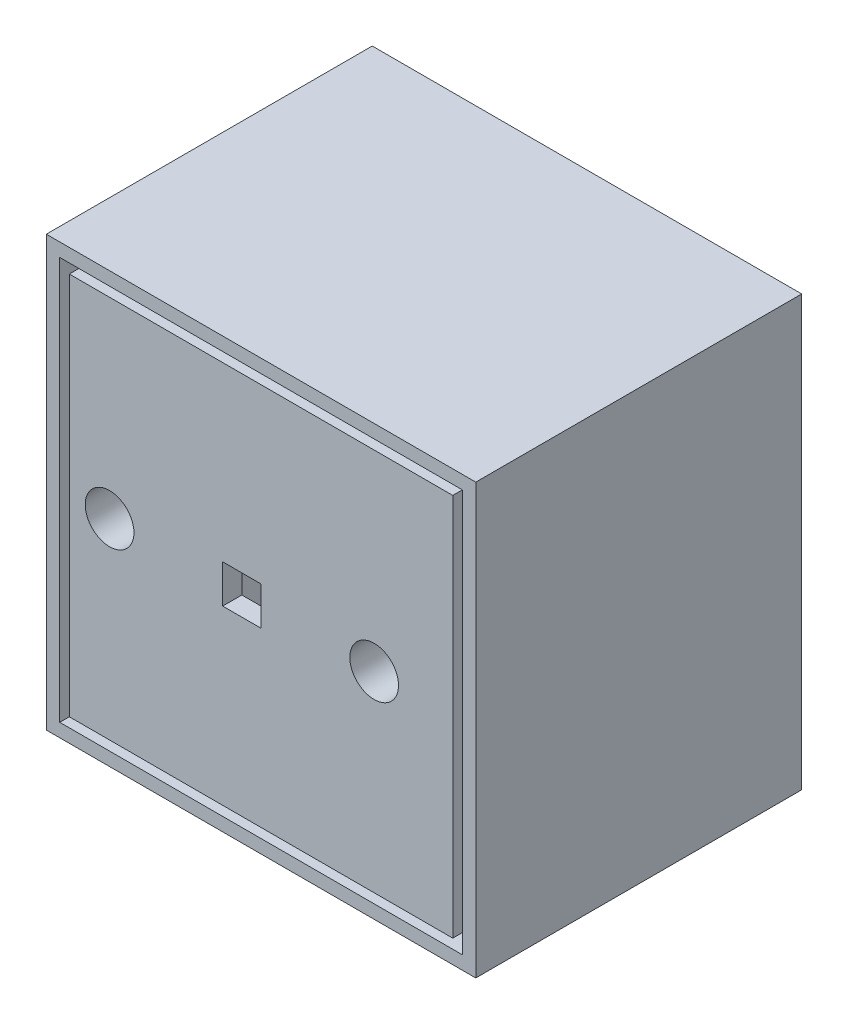
ISO-10303-21;
HEADER;
FILE_DESCRIPTION(('STEP AP214'),'2;1');
FILE_NAME('part.step','',(''),(''),'','','');
FILE_SCHEMA(('AUTOMOTIVE_DESIGN { 1 0 10303 214 1 1 1 1 }'));
ENDSEC;
DATA;
#1=APPLICATION_CONTEXT('core data for automotive mechanical design processes');
#2=APPLICATION_PROTOCOL_DEFINITION('international standard','automotive_design',2000,#1);
#3=PRODUCT_CONTEXT('',#1,'mechanical');
#4=PRODUCT('Part','Part','',(#3));
#5=PRODUCT_RELATED_PRODUCT_CATEGORY('part','',(#4));
#6=PRODUCT_DEFINITION_FORMATION('','',#4);
#7=PRODUCT_DEFINITION_CONTEXT('part definition',#1,'design');
#8=PRODUCT_DEFINITION('design','',#6,#7);
#9=PRODUCT_DEFINITION_SHAPE('','',#8);
#10=(LENGTH_UNIT() NAMED_UNIT(*) SI_UNIT(.MILLI.,.METRE.));
#11=(NAMED_UNIT(*) PLANE_ANGLE_UNIT() SI_UNIT($,.RADIAN.));
#12=(NAMED_UNIT(*) SI_UNIT($,.STERADIAN.) SOLID_ANGLE_UNIT());
#13=UNCERTAINTY_MEASURE_WITH_UNIT(LENGTH_MEASURE(1.E-05),#10,'distance_accuracy_value','');
#14=(GEOMETRIC_REPRESENTATION_CONTEXT(3) GLOBAL_UNCERTAINTY_ASSIGNED_CONTEXT((#13)) GLOBAL_UNIT_ASSIGNED_CONTEXT((#10,
#11,#12)) REPRESENTATION_CONTEXT('',''));
#15=CARTESIAN_POINT('',(0.,0.,0.));
#16=DIRECTION('',(0.,0.,1.));
#17=DIRECTION('',(1.,0.,0.));
#18=AXIS2_PLACEMENT_3D('',#15,#16,#17);
#19=CARTESIAN_POINT('',(0.,5.,5.));
#20=DIRECTION('',(-1.,0.,0.));
#21=DIRECTION('',(0.,-1.,0.));
#22=AXIS2_PLACEMENT_3D('',#19,#20,#21);
#23=PLANE('',#22);
#24=DIRECTION('',(0.,0.,-1.));
#25=VECTOR('',#24,1.);
#26=CARTESIAN_POINT('',(0.,5.,5.));
#27=LINE('',#26,#25);
#28=CARTESIAN_POINT('',(0.,5.,25.));
#29=VERTEX_POINT('',#28);
#30=CARTESIAN_POINT('',(0.,5.,20.));
#31=VERTEX_POINT('',#30);
#32=EDGE_CURVE('E497',#29,#31,#27,.T.);
#33=ORIENTED_EDGE('',*,*,#32,.T.);
#34=DIRECTION('',(0.,-1.,0.));
#35=VECTOR('',#34,1.);
#36=CARTESIAN_POINT('',(0.,5.,20.));
#37=LINE('',#36,#35);
#38=CARTESIAN_POINT('',(0.,-5.,20.));
#39=VERTEX_POINT('',#38);
#40=EDGE_CURVE('E345',#31,#39,#37,.T.);
#41=ORIENTED_EDGE('',*,*,#40,.T.);
#42=DIRECTION('',(0.,0.,-1.));
#43=VECTOR('',#42,1.);
#44=CARTESIAN_POINT('',(0.,-5.,5.));
#45=LINE('',#44,#43);
#46=CARTESIAN_POINT('',(0.,-5.,25.));
#47=VERTEX_POINT('',#46);
#48=EDGE_CURVE('E485',#47,#39,#45,.T.);
#49=ORIENTED_EDGE('',*,*,#48,.F.);
#50=DIRECTION('',(0.,-1.,0.));
#51=VECTOR('',#50,1.);
#52=CARTESIAN_POINT('',(0.,0.,25.));
#53=LINE('',#52,#51);
#54=EDGE_CURVE('E438',#29,#47,#53,.T.);
#55=ORIENTED_EDGE('',*,*,#54,.F.);
#56=EDGE_LOOP('',(#33,#41,#49,#55));
#57=FACE_BOUND('',#56,.T.);
#58=ADVANCED_FACE('F65',(#57),#23,.T.);
#59=CARTESIAN_POINT('',(-10.,5.,5.));
#60=DIRECTION('',(0.,-1.,0.));
#61=DIRECTION('',(0.,0.,-1.));
#62=AXIS2_PLACEMENT_3D('',#59,#60,#61);
#63=PLANE('',#62);
#64=DIRECTION('',(0.,0.,-1.));
#65=VECTOR('',#64,1.);
#66=CARTESIAN_POINT('',(-10.,5.,5.));
#67=LINE('',#66,#65);
#68=CARTESIAN_POINT('',(-10.,5.,25.));
#69=VERTEX_POINT('',#68);
#70=CARTESIAN_POINT('',(-10.,5.,20.));
#71=VERTEX_POINT('',#70);
#72=EDGE_CURVE('E493',#69,#71,#67,.T.);
#73=ORIENTED_EDGE('',*,*,#72,.T.);
#74=DIRECTION('',(1.,0.,0.));
#75=VECTOR('',#74,1.);
#76=CARTESIAN_POINT('',(-10.,5.,20.));
#77=LINE('',#76,#75);
#78=EDGE_CURVE('E341',#71,#31,#77,.T.);
#79=ORIENTED_EDGE('',*,*,#78,.T.);
#80=ORIENTED_EDGE('',*,*,#32,.F.);
#81=DIRECTION('',(1.,0.,0.));
#82=VECTOR('',#81,1.);
#83=CARTESIAN_POINT('',(0.,5.,25.));
#84=LINE('',#83,#82);
#85=EDGE_CURVE('E434',#69,#29,#84,.T.);
#86=ORIENTED_EDGE('',*,*,#85,.F.);
#87=EDGE_LOOP('',(#73,#79,#80,#86));
#88=FACE_BOUND('',#87,.T.);
#89=ADVANCED_FACE('F540',(#88),#63,.T.);
#90=CARTESIAN_POINT('',(-10.,5.,5.));
#91=DIRECTION('',(1.,0.,0.));
#92=DIRECTION('',(0.,0.,-1.));
#93=AXIS2_PLACEMENT_3D('',#90,#91,#92);
#94=PLANE('',#93);
#95=DIRECTION('',(0.,0.,-1.));
#96=VECTOR('',#95,1.);
#97=CARTESIAN_POINT('',(-10.,-5.,5.));
#98=LINE('',#97,#96);
#99=CARTESIAN_POINT('',(-10.,-5.,25.));
#100=VERTEX_POINT('',#99);
#101=CARTESIAN_POINT('',(-10.,-5.,20.));
#102=VERTEX_POINT('',#101);
#103=EDGE_CURVE('E489',#100,#102,#98,.T.);
#104=ORIENTED_EDGE('',*,*,#103,.T.);
#105=DIRECTION('',(0.,1.,0.));
#106=VECTOR('',#105,1.);
#107=CARTESIAN_POINT('',(-10.,5.,20.));
#108=LINE('',#107,#106);
#109=EDGE_CURVE('E329',#102,#71,#108,.T.);
#110=ORIENTED_EDGE('',*,*,#109,.T.);
#111=ORIENTED_EDGE('',*,*,#72,.F.);
#112=DIRECTION('',(0.,1.,0.));
#113=VECTOR('',#112,1.);
#114=CARTESIAN_POINT('',(-10.,0.,25.));
#115=LINE('',#114,#113);
#116=EDGE_CURVE('E446',#100,#69,#115,.T.);
#117=ORIENTED_EDGE('',*,*,#116,.F.);
#118=EDGE_LOOP('',(#104,#110,#111,#117));
#119=FACE_BOUND('',#118,.T.);
#120=ADVANCED_FACE('F546',(#119),#94,.T.);
#121=CARTESIAN_POINT('',(-10.,-5.,5.));
#122=DIRECTION('',(0.,1.,0.));
#123=DIRECTION('',(0.,0.,1.));
#124=AXIS2_PLACEMENT_3D('',#121,#122,#123);
#125=PLANE('',#124);
#126=ORIENTED_EDGE('',*,*,#48,.T.);
#127=DIRECTION('',(-1.,0.,0.));
#128=VECTOR('',#127,1.);
#129=CARTESIAN_POINT('',(-10.,-5.,20.));
#130=LINE('',#129,#128);
#131=EDGE_CURVE('E12',#39,#102,#130,.T.);
#132=ORIENTED_EDGE('',*,*,#131,.T.);
#133=ORIENTED_EDGE('',*,*,#103,.F.);
#134=DIRECTION('',(-1.,0.,0.));
#135=VECTOR('',#134,1.);
#136=CARTESIAN_POINT('',(0.,-5.,25.));
#137=LINE('',#136,#135);
#138=EDGE_CURVE('E442',#47,#100,#137,.T.);
#139=ORIENTED_EDGE('',*,*,#138,.F.);
#140=EDGE_LOOP('',(#126,#132,#133,#139));
#141=FACE_BOUND('',#140,.T.);
#142=ADVANCED_FACE('F554',(#141),#125,.T.);
#143=CARTESIAN_POINT('',(0.,0.,5.));
#144=DIRECTION('',(0.,0.,-1.));
#145=DIRECTION('',(-1.,0.,0.));
#146=AXIS2_PLACEMENT_3D('',#143,#144,#145);
#147=PLANE('',#146);
#148=DIRECTION('',(1.,0.,0.));
#149=VECTOR('',#148,1.);
#150=CARTESIAN_POINT('',(0.,-52.5,5.));
#151=LINE('',#150,#149);
#152=CARTESIAN_POINT('',(-52.5,-52.5,5.));
#153=VERTEX_POINT('',#152);
#154=CARTESIAN_POINT('',(52.5,-52.5,5.));
#155=VERTEX_POINT('',#154);
#156=EDGE_CURVE('E384',#153,#155,#151,.T.);
#157=ORIENTED_EDGE('',*,*,#156,.T.);
#158=DIRECTION('',(0.,1.,0.));
#159=VECTOR('',#158,1.);
#160=CARTESIAN_POINT('',(52.5,0.,5.));
#161=LINE('',#160,#159);
#162=CARTESIAN_POINT('',(52.5,52.5,5.));
#163=VERTEX_POINT('',#162);
#164=EDGE_CURVE('E349',#155,#163,#161,.T.);
#165=ORIENTED_EDGE('',*,*,#164,.T.);
#166=DIRECTION('',(1.,0.,0.));
#167=VECTOR('',#166,1.);
#168=CARTESIAN_POINT('',(0.,52.5,5.));
#169=LINE('',#168,#167);
#170=CARTESIAN_POINT('',(-52.5,52.5,5.));
#171=VERTEX_POINT('',#170);
#172=EDGE_CURVE('E355',#171,#163,#169,.T.);
#173=ORIENTED_EDGE('',*,*,#172,.F.);
#174=DIRECTION('',(0.,1.,0.));
#175=VECTOR('',#174,1.);
#176=CARTESIAN_POINT('',(-52.5,0.,5.));
#177=LINE('',#176,#175);
#178=EDGE_CURVE('E387',#153,#171,#177,.T.);
#179=ORIENTED_EDGE('',*,*,#178,.F.);
#180=EDGE_LOOP('',(#157,#165,#173,#179));
#181=FACE_BOUND('',#180,.T.);
#182=DIRECTION('',(1.,0.,0.));
#183=VECTOR('',#182,1.);
#184=CARTESIAN_POINT('',(0.,50.,5.));
#185=LINE('',#184,#183);
#186=CARTESIAN_POINT('',(-50.,50.,5.));
#187=VERTEX_POINT('',#186);
#188=CARTESIAN_POINT('',(50.,50.,5.));
#189=VERTEX_POINT('',#188);
#190=EDGE_CURVE('E462',#187,#189,#185,.T.);
#191=ORIENTED_EDGE('',*,*,#190,.T.);
#192=DIRECTION('',(0.,-1.,0.));
#193=VECTOR('',#192,1.);
#194=CARTESIAN_POINT('',(50.,0.,5.));
#195=LINE('',#194,#193);
#196=CARTESIAN_POINT('',(50.,-50.,5.));
#197=VERTEX_POINT('',#196);
#198=EDGE_CURVE('E458',#189,#197,#195,.T.);
#199=ORIENTED_EDGE('',*,*,#198,.T.);
#200=DIRECTION('',(1.,0.,0.));
#201=VECTOR('',#200,1.);
#202=CARTESIAN_POINT('',(0.,-50.,5.));
#203=LINE('',#202,#201);
#204=CARTESIAN_POINT('',(-50.,-50.,5.));
#205=VERTEX_POINT('',#204);
#206=EDGE_CURVE('E415',#205,#197,#203,.T.);
#207=ORIENTED_EDGE('',*,*,#206,.F.);
#208=DIRECTION('',(0.,-1.,0.));
#209=VECTOR('',#208,1.);
#210=CARTESIAN_POINT('',(-50.,0.,5.));
#211=LINE('',#210,#209);
#212=EDGE_CURVE('E466',#187,#205,#211,.T.);
#213=ORIENTED_EDGE('',*,*,#212,.F.);
#214=EDGE_LOOP('',(#191,#199,#207,#213));
#215=FACE_BOUND('',#214,.T.);
#216=ADVANCED_FACE('F551',(#181,#215),#147,.F.);
#217=CARTESIAN_POINT('',(0.,0.,0.));
#218=DIRECTION('',(0.,0.,-1.));
#219=DIRECTION('',(-1.,0.,0.));
#220=AXIS2_PLACEMENT_3D('',#217,#218,#219);
#221=PLANE('',#220);
#222=DIRECTION('',(0.,1.,0.));
#223=VECTOR('',#222,1.);
#224=CARTESIAN_POINT('',(-50.,0.,0.));
#225=LINE('',#224,#223);
#226=CARTESIAN_POINT('',(-50.,-50.,0.));
#227=VERTEX_POINT('',#226);
#228=CARTESIAN_POINT('',(-50.,50.,0.));
#229=VERTEX_POINT('',#228);
#230=EDGE_CURVE('E234',#227,#229,#225,.T.);
#231=ORIENTED_EDGE('',*,*,#230,.T.);
#232=DIRECTION('',(-1.,0.,0.));
#233=VECTOR('',#232,1.);
#234=CARTESIAN_POINT('',(0.,50.,0.));
#235=LINE('',#234,#233);
#236=CARTESIAN_POINT('',(50.,50.,0.));
#237=VERTEX_POINT('',#236);
#238=EDGE_CURVE('E250',#237,#229,#235,.T.);
#239=ORIENTED_EDGE('',*,*,#238,.F.);
#240=DIRECTION('',(0.,1.,0.));
#241=VECTOR('',#240,1.);
#242=CARTESIAN_POINT('',(50.,0.,0.));
#243=LINE('',#242,#241);
#244=CARTESIAN_POINT('',(50.,-50.,0.));
#245=VERTEX_POINT('',#244);
#246=EDGE_CURVE('E284',#245,#237,#243,.T.);
#247=ORIENTED_EDGE('',*,*,#246,.F.);
#248=DIRECTION('',(-1.,0.,0.));
#249=VECTOR('',#248,1.);
#250=CARTESIAN_POINT('',(0.,-50.,0.));
#251=LINE('',#250,#249);
#252=EDGE_CURVE('E281',#245,#227,#251,.T.);
#253=ORIENTED_EDGE('',*,*,#252,.T.);
#254=EDGE_LOOP('',(#231,#239,#247,#253));
#255=FACE_BOUND('',#254,.T.);
#256=DIRECTION('',(0.,1.,0.));
#257=VECTOR('',#256,1.);
#258=CARTESIAN_POINT('',(-30.,25.,0.));
#259=LINE('',#258,#257);
#260=CARTESIAN_POINT('',(-30.,-25.,0.));
#261=VERTEX_POINT('',#260);
#262=CARTESIAN_POINT('',(-30.,25.,0.));
#263=VERTEX_POINT('',#262);
#264=EDGE_CURVE('E89',#261,#263,#259,.T.);
#265=ORIENTED_EDGE('',*,*,#264,.F.);
#266=DIRECTION('',(-1.,0.,0.));
#267=VECTOR('',#266,1.);
#268=CARTESIAN_POINT('',(20.,-25.,0.));
#269=LINE('',#268,#267);
#270=CARTESIAN_POINT('',(20.,-25.,0.));
#271=VERTEX_POINT('',#270);
#272=EDGE_CURVE('E300',#271,#261,#269,.T.);
#273=ORIENTED_EDGE('',*,*,#272,.F.);
#274=DIRECTION('',(0.,-1.,0.));
#275=VECTOR('',#274,1.);
#276=CARTESIAN_POINT('',(20.,25.,0.));
#277=LINE('',#276,#275);
#278=CARTESIAN_POINT('',(20.,25.,0.));
#279=VERTEX_POINT('',#278);
#280=EDGE_CURVE('E319',#279,#271,#277,.T.);
#281=ORIENTED_EDGE('',*,*,#280,.F.);
#282=DIRECTION('',(1.,0.,0.));
#283=VECTOR('',#282,1.);
#284=CARTESIAN_POINT('',(20.,25.,0.));
#285=LINE('',#284,#283);
#286=EDGE_CURVE('E315',#263,#279,#285,.T.);
#287=ORIENTED_EDGE('',*,*,#286,.F.);
#288=EDGE_LOOP('',(#265,#273,#281,#287));
#289=FACE_BOUND('',#288,.T.);
#290=ADVANCED_FACE('F553',(#255,#289),#221,.T.);
#291=CARTESIAN_POINT('',(56.,-56.,5.));
#292=DIRECTION('',(-1.,0.,0.));
#293=DIRECTION('',(0.,0.,1.));
#294=AXIS2_PLACEMENT_3D('',#291,#292,#293);
#295=PLANE('',#294);
#296=DIRECTION('',(0.,0.,-1.));
#297=VECTOR('',#296,1.);
#298=CARTESIAN_POINT('',(56.,-56.,5.));
#299=LINE('',#298,#297);
#300=CARTESIAN_POINT('',(56.,-56.,25.));
#301=VERTEX_POINT('',#300);
#302=CARTESIAN_POINT('',(56.,-56.,-60.));
#303=VERTEX_POINT('',#302);
#304=EDGE_CURVE('E501',#301,#303,#299,.T.);
#305=ORIENTED_EDGE('',*,*,#304,.T.);
#306=DIRECTION('',(0.,-1.,0.));
#307=VECTOR('',#306,1.);
#308=CARTESIAN_POINT('',(56.,0.,-60.));
#309=LINE('',#308,#307);
#310=CARTESIAN_POINT('',(56.,56.,-60.));
#311=VERTEX_POINT('',#310);
#312=EDGE_CURVE('E266',#311,#303,#309,.T.);
#313=ORIENTED_EDGE('',*,*,#312,.F.);
#314=DIRECTION('',(0.,0.,-1.));
#315=VECTOR('',#314,1.);
#316=CARTESIAN_POINT('',(56.,56.,5.));
#317=LINE('',#316,#315);
#318=CARTESIAN_POINT('',(56.,56.,25.));
#319=VERTEX_POINT('',#318);
#320=EDGE_CURVE('E74',#319,#311,#317,.T.);
#321=ORIENTED_EDGE('',*,*,#320,.F.);
#322=DIRECTION('',(0.,1.,0.));
#323=VECTOR('',#322,1.);
#324=CARTESIAN_POINT('',(56.,0.,25.));
#325=LINE('',#324,#323);
#326=EDGE_CURVE('E369',#301,#319,#325,.T.);
#327=ORIENTED_EDGE('',*,*,#326,.F.);
#328=EDGE_LOOP('',(#305,#313,#321,#327));
#329=FACE_BOUND('',#328,.T.);
#330=ADVANCED_FACE('F67',(#329),#295,.F.);
#331=CARTESIAN_POINT('',(-56.,56.,5.));
#332=DIRECTION('',(0.,-1.,0.));
#333=DIRECTION('',(0.,0.,-1.));
#334=AXIS2_PLACEMENT_3D('',#331,#332,#333);
#335=PLANE('',#334);
#336=ORIENTED_EDGE('',*,*,#320,.T.);
#337=DIRECTION('',(1.,0.,0.));
#338=VECTOR('',#337,1.);
#339=CARTESIAN_POINT('',(0.,56.,-60.));
#340=LINE('',#339,#338);
#341=CARTESIAN_POINT('',(-56.,56.,-60.));
#342=VERTEX_POINT('',#341);
#343=EDGE_CURVE('E262',#342,#311,#340,.T.);
#344=ORIENTED_EDGE('',*,*,#343,.F.);
#345=DIRECTION('',(0.,0.,-1.));
#346=VECTOR('',#345,1.);
#347=CARTESIAN_POINT('',(-56.,56.,5.));
#348=LINE('',#347,#346);
#349=CARTESIAN_POINT('',(-56.,56.,25.));
#350=VERTEX_POINT('',#349);
#351=EDGE_CURVE('E507',#350,#342,#348,.T.);
#352=ORIENTED_EDGE('',*,*,#351,.F.);
#353=DIRECTION('',(-1.,0.,0.));
#354=VECTOR('',#353,1.);
#355=CARTESIAN_POINT('',(0.,56.,25.));
#356=LINE('',#355,#354);
#357=EDGE_CURVE('E373',#319,#350,#356,.T.);
#358=ORIENTED_EDGE('',*,*,#357,.F.);
#359=EDGE_LOOP('',(#336,#344,#352,#358));
#360=FACE_BOUND('',#359,.T.);
#361=ADVANCED_FACE('F514',(#360),#335,.F.);
#362=CARTESIAN_POINT('',(-56.,-56.,5.));
#363=DIRECTION('',(1.,0.,0.));
#364=DIRECTION('',(0.,0.,-1.));
#365=AXIS2_PLACEMENT_3D('',#362,#363,#364);
#366=PLANE('',#365);
#367=ORIENTED_EDGE('',*,*,#351,.T.);
#368=DIRECTION('',(0.,1.,0.));
#369=VECTOR('',#368,1.);
#370=CARTESIAN_POINT('',(-56.,0.,-60.));
#371=LINE('',#370,#369);
#372=CARTESIAN_POINT('',(-56.,-56.,-60.));
#373=VERTEX_POINT('',#372);
#374=EDGE_CURVE('E274',#373,#342,#371,.T.);
#375=ORIENTED_EDGE('',*,*,#374,.F.);
#376=DIRECTION('',(0.,0.,-1.));
#377=VECTOR('',#376,1.);
#378=CARTESIAN_POINT('',(-56.,-56.,5.));
#379=LINE('',#378,#377);
#380=CARTESIAN_POINT('',(-56.,-56.,25.));
#381=VERTEX_POINT('',#380);
#382=EDGE_CURVE('E504',#381,#373,#379,.T.);
#383=ORIENTED_EDGE('',*,*,#382,.F.);
#384=DIRECTION('',(0.,-1.,0.));
#385=VECTOR('',#384,1.);
#386=CARTESIAN_POINT('',(-56.,0.,25.));
#387=LINE('',#386,#385);
#388=EDGE_CURVE('E377',#350,#381,#387,.T.);
#389=ORIENTED_EDGE('',*,*,#388,.F.);
#390=EDGE_LOOP('',(#367,#375,#383,#389));
#391=FACE_BOUND('',#390,.T.);
#392=ADVANCED_FACE('F520',(#391),#366,.F.);
#393=CARTESIAN_POINT('',(-56.,-56.,5.));
#394=DIRECTION('',(0.,1.,0.));
#395=DIRECTION('',(0.,0.,1.));
#396=AXIS2_PLACEMENT_3D('',#393,#394,#395);
#397=PLANE('',#396);
#398=ORIENTED_EDGE('',*,*,#382,.T.);
#399=DIRECTION('',(-1.,0.,0.));
#400=VECTOR('',#399,1.);
#401=CARTESIAN_POINT('',(0.,-56.,-60.));
#402=LINE('',#401,#400);
#403=EDGE_CURVE('E270',#303,#373,#402,.T.);
#404=ORIENTED_EDGE('',*,*,#403,.F.);
#405=ORIENTED_EDGE('',*,*,#304,.F.);
#406=DIRECTION('',(1.,0.,0.));
#407=VECTOR('',#406,1.);
#408=CARTESIAN_POINT('',(0.,-56.,25.));
#409=LINE('',#408,#407);
#410=EDGE_CURVE('E365',#381,#301,#409,.T.);
#411=ORIENTED_EDGE('',*,*,#410,.F.);
#412=EDGE_LOOP('',(#398,#404,#405,#411));
#413=FACE_BOUND('',#412,.T.);
#414=ADVANCED_FACE('F526',(#413),#397,.F.);
#415=CARTESIAN_POINT('',(50.,0.,25.));
#416=DIRECTION('',(1.,0.,0.));
#417=DIRECTION('',(0.,1.,0.));
#418=AXIS2_PLACEMENT_3D('',#415,#416,#417);
#419=PLANE('',#418);
#420=ORIENTED_EDGE('',*,*,#198,.F.);
#421=DIRECTION('',(0.,0.,-1.));
#422=VECTOR('',#421,1.);
#423=CARTESIAN_POINT('',(50.,50.,25.));
#424=LINE('',#423,#422);
#425=CARTESIAN_POINT('',(50.,50.,25.));
#426=VERTEX_POINT('',#425);
#427=EDGE_CURVE('E481',#426,#189,#424,.T.);
#428=ORIENTED_EDGE('',*,*,#427,.F.);
#429=DIRECTION('',(0.,-1.,0.));
#430=VECTOR('',#429,1.);
#431=CARTESIAN_POINT('',(50.,0.,25.));
#432=LINE('',#431,#430);
#433=CARTESIAN_POINT('',(50.,-50.,25.));
#434=VERTEX_POINT('',#433);
#435=EDGE_CURVE('E419',#426,#434,#432,.T.);
#436=ORIENTED_EDGE('',*,*,#435,.T.);
#437=DIRECTION('',(0.,0.,-1.));
#438=VECTOR('',#437,1.);
#439=CARTESIAN_POINT('',(50.,-50.,25.));
#440=LINE('',#439,#438);
#441=EDGE_CURVE('E450',#434,#197,#440,.T.);
#442=ORIENTED_EDGE('',*,*,#441,.T.);
#443=EDGE_LOOP('',(#420,#428,#436,#442));
#444=FACE_BOUND('',#443,.T.);
#445=ADVANCED_FACE('F528',(#444),#419,.T.);
#446=CARTESIAN_POINT('',(0.,50.,25.));
#447=DIRECTION('',(0.,1.,0.));
#448=DIRECTION('',(0.,0.,1.));
#449=AXIS2_PLACEMENT_3D('',#446,#447,#448);
#450=PLANE('',#449);
#451=ORIENTED_EDGE('',*,*,#190,.F.);
#452=DIRECTION('',(0.,0.,-1.));
#453=VECTOR('',#452,1.);
#454=CARTESIAN_POINT('',(-50.,50.,25.));
#455=LINE('',#454,#453);
#456=CARTESIAN_POINT('',(-50.,50.,25.));
#457=VERTEX_POINT('',#456);
#458=EDGE_CURVE('E478',#457,#187,#455,.T.);
#459=ORIENTED_EDGE('',*,*,#458,.F.);
#460=DIRECTION('',(1.,0.,0.));
#461=VECTOR('',#460,1.);
#462=CARTESIAN_POINT('',(0.,50.,25.));
#463=LINE('',#462,#461);
#464=EDGE_CURVE('E423',#457,#426,#463,.T.);
#465=ORIENTED_EDGE('',*,*,#464,.T.);
#466=ORIENTED_EDGE('',*,*,#427,.T.);
#467=EDGE_LOOP('',(#451,#459,#465,#466));
#468=FACE_BOUND('',#467,.T.);
#469=ADVANCED_FACE('F534',(#468),#450,.T.);
#470=CARTESIAN_POINT('',(-50.,0.,25.));
#471=DIRECTION('',(1.,0.,0.));
#472=DIRECTION('',(0.,1.,0.));
#473=AXIS2_PLACEMENT_3D('',#470,#471,#472);
#474=PLANE('',#473);
#475=ORIENTED_EDGE('',*,*,#212,.T.);
#476=DIRECTION('',(0.,0.,-1.));
#477=VECTOR('',#476,1.);
#478=CARTESIAN_POINT('',(-50.,-50.,25.));
#479=LINE('',#478,#477);
#480=CARTESIAN_POINT('',(-50.,-50.,25.));
#481=VERTEX_POINT('',#480);
#482=EDGE_CURVE('E475',#481,#205,#479,.T.);
#483=ORIENTED_EDGE('',*,*,#482,.F.);
#484=DIRECTION('',(0.,-1.,0.));
#485=VECTOR('',#484,1.);
#486=CARTESIAN_POINT('',(-50.,0.,25.));
#487=LINE('',#486,#485);
#488=EDGE_CURVE('E427',#457,#481,#487,.T.);
#489=ORIENTED_EDGE('',*,*,#488,.F.);
#490=ORIENTED_EDGE('',*,*,#458,.T.);
#491=EDGE_LOOP('',(#475,#483,#489,#490));
#492=FACE_BOUND('',#491,.T.);
#493=ADVANCED_FACE('F621',(#492),#474,.F.);
#494=CARTESIAN_POINT('',(0.,-50.,25.));
#495=DIRECTION('',(0.,1.,0.));
#496=DIRECTION('',(0.,0.,1.));
#497=AXIS2_PLACEMENT_3D('',#494,#495,#496);
#498=PLANE('',#497);
#499=ORIENTED_EDGE('',*,*,#206,.T.);
#500=ORIENTED_EDGE('',*,*,#441,.F.);
#501=DIRECTION('',(1.,0.,0.));
#502=VECTOR('',#501,1.);
#503=CARTESIAN_POINT('',(0.,-50.,25.));
#504=LINE('',#503,#502);
#505=EDGE_CURVE('E431',#481,#434,#504,.T.);
#506=ORIENTED_EDGE('',*,*,#505,.F.);
#507=ORIENTED_EDGE('',*,*,#482,.T.);
#508=EDGE_LOOP('',(#499,#500,#506,#507));
#509=FACE_BOUND('',#508,.T.);
#510=ADVANCED_FACE('F617',(#509),#498,.F.);
#511=CARTESIAN_POINT('',(-39.5,0.,25.));
#512=DIRECTION('',(0.,0.,-1.));
#513=DIRECTION('',(-1.,0.,0.));
#514=AXIS2_PLACEMENT_3D('',#511,#512,#513);
#515=CYLINDRICAL_SURFACE('',#514,6.35);
#516=CARTESIAN_POINT('',(-39.5,0.,25.));
#517=DIRECTION('',(0.,0.,1.));
#518=DIRECTION('',(1.,0.,0.));
#519=AXIS2_PLACEMENT_3D('',#516,#517,#518);
#520=CIRCLE('',#519,6.35);
#521=CARTESIAN_POINT('',(-33.15,0.,25.));
#522=VERTEX_POINT('',#521);
#523=EDGE_CURVE('E414',#522,#522,#520,.T.);
#524=ORIENTED_EDGE('',*,*,#523,.T.);
#525=EDGE_LOOP('',(#524));
#526=FACE_BOUND('',#525,.T.);
#527=CARTESIAN_POINT('',(-39.5,0.,5.));
#528=DIRECTION('',(0.,0.,1.));
#529=DIRECTION('',(1.,0.,0.));
#530=AXIS2_PLACEMENT_3D('',#527,#528,#529);
#531=CIRCLE('',#530,6.35);
#532=CARTESIAN_POINT('',(-33.15,0.,5.));
#533=VERTEX_POINT('',#532);
#534=EDGE_CURVE('E454',#533,#533,#531,.T.);
#535=ORIENTED_EDGE('',*,*,#534,.F.);
#536=EDGE_LOOP('',(#535));
#537=FACE_BOUND('',#536,.T.);
#538=ADVANCED_FACE('F620',(#526,#537),#515,.F.);
#539=CARTESIAN_POINT('',(29.5,0.,25.));
#540=DIRECTION('',(0.,0.,-1.));
#541=DIRECTION('',(-1.,0.,0.));
#542=AXIS2_PLACEMENT_3D('',#539,#540,#541);
#543=CYLINDRICAL_SURFACE('',#542,6.35);
#544=CARTESIAN_POINT('',(29.5,0.,25.));
#545=DIRECTION('',(0.,0.,1.));
#546=DIRECTION('',(1.,0.,0.));
#547=AXIS2_PLACEMENT_3D('',#544,#545,#546);
#548=CIRCLE('',#547,6.35);
#549=CARTESIAN_POINT('',(35.85,0.,25.));
#550=VERTEX_POINT('',#549);
#551=EDGE_CURVE('E410',#550,#550,#548,.T.);
#552=ORIENTED_EDGE('',*,*,#551,.T.);
#553=EDGE_LOOP('',(#552));
#554=FACE_BOUND('',#553,.T.);
#555=CARTESIAN_POINT('',(29.5,0.,5.));
#556=DIRECTION('',(0.,0.,1.));
#557=DIRECTION('',(1.,0.,0.));
#558=AXIS2_PLACEMENT_3D('',#555,#556,#557);
#559=CIRCLE('',#558,6.35);
#560=CARTESIAN_POINT('',(35.85,0.,5.));
#561=VERTEX_POINT('',#560);
#562=EDGE_CURVE('E409',#561,#561,#559,.T.);
#563=ORIENTED_EDGE('',*,*,#562,.F.);
#564=EDGE_LOOP('',(#563));
#565=FACE_BOUND('',#564,.T.);
#566=ADVANCED_FACE('F615',(#554,#565),#543,.F.);
#567=CARTESIAN_POINT('',(0.,0.,25.));
#568=DIRECTION('',(0.,0.,1.));
#569=DIRECTION('',(1.,0.,0.));
#570=AXIS2_PLACEMENT_3D('',#567,#568,#569);
#571=PLANE('',#570);
#572=ORIENTED_EDGE('',*,*,#551,.F.);
#573=EDGE_LOOP('',(#572));
#574=FACE_BOUND('',#573,.T.);
#575=ORIENTED_EDGE('',*,*,#523,.F.);
#576=EDGE_LOOP('',(#575));
#577=FACE_BOUND('',#576,.T.);
#578=ORIENTED_EDGE('',*,*,#435,.F.);
#579=ORIENTED_EDGE('',*,*,#464,.F.);
#580=ORIENTED_EDGE('',*,*,#488,.T.);
#581=ORIENTED_EDGE('',*,*,#505,.T.);
#582=EDGE_LOOP('',(#578,#579,#580,#581));
#583=FACE_BOUND('',#582,.T.);
#584=ORIENTED_EDGE('',*,*,#85,.T.);
#585=ORIENTED_EDGE('',*,*,#54,.T.);
#586=ORIENTED_EDGE('',*,*,#138,.T.);
#587=ORIENTED_EDGE('',*,*,#116,.T.);
#588=EDGE_LOOP('',(#584,#585,#586,#587));
#589=FACE_BOUND('',#588,.T.);
#590=ADVANCED_FACE('F612',(#574,#577,#583,#589),#571,.T.);
#591=ORIENTED_EDGE('',*,*,#534,.T.);
#592=EDGE_LOOP('',(#591));
#593=FACE_BOUND('',#592,.T.);
#594=ADVANCED_FACE('F557',(#593),#147,.F.);
#595=ORIENTED_EDGE('',*,*,#562,.T.);
#596=EDGE_LOOP('',(#595));
#597=FACE_BOUND('',#596,.T.);
#598=ADVANCED_FACE('F556',(#597),#147,.F.);
#599=CARTESIAN_POINT('',(52.5,0.,25.));
#600=DIRECTION('',(-1.,0.,0.));
#601=DIRECTION('',(0.,0.,1.));
#602=AXIS2_PLACEMENT_3D('',#599,#600,#601);
#603=PLANE('',#602);
#604=ORIENTED_EDGE('',*,*,#164,.F.);
#605=DIRECTION('',(0.,0.,-1.));
#606=VECTOR('',#605,1.);
#607=CARTESIAN_POINT('',(52.5,-52.5,25.));
#608=LINE('',#607,#606);
#609=CARTESIAN_POINT('',(52.5,-52.5,25.));
#610=VERTEX_POINT('',#609);
#611=EDGE_CURVE('E405',#610,#155,#608,.T.);
#612=ORIENTED_EDGE('',*,*,#611,.F.);
#613=DIRECTION('',(0.,1.,0.));
#614=VECTOR('',#613,1.);
#615=CARTESIAN_POINT('',(52.5,0.,25.));
#616=LINE('',#615,#614);
#617=CARTESIAN_POINT('',(52.5,52.5,25.));
#618=VERTEX_POINT('',#617);
#619=EDGE_CURVE('E350',#610,#618,#616,.T.);
#620=ORIENTED_EDGE('',*,*,#619,.T.);
#621=DIRECTION('',(0.,0.,-1.));
#622=VECTOR('',#621,1.);
#623=CARTESIAN_POINT('',(52.5,52.5,25.));
#624=LINE('',#623,#622);
#625=EDGE_CURVE('E381',#618,#163,#624,.T.);
#626=ORIENTED_EDGE('',*,*,#625,.T.);
#627=EDGE_LOOP('',(#604,#612,#620,#626));
#628=FACE_BOUND('',#627,.T.);
#629=ADVANCED_FACE('F607',(#628),#603,.T.);
#630=CARTESIAN_POINT('',(0.,-52.5,25.));
#631=DIRECTION('',(0.,1.,0.));
#632=DIRECTION('',(0.,0.,1.));
#633=AXIS2_PLACEMENT_3D('',#630,#631,#632);
#634=PLANE('',#633);
#635=ORIENTED_EDGE('',*,*,#156,.F.);
#636=DIRECTION('',(0.,0.,-1.));
#637=VECTOR('',#636,1.);
#638=CARTESIAN_POINT('',(-52.5,-52.5,25.));
#639=LINE('',#638,#637);
#640=CARTESIAN_POINT('',(-52.5,-52.5,25.));
#641=VERTEX_POINT('',#640);
#642=EDGE_CURVE('E401',#641,#153,#639,.T.);
#643=ORIENTED_EDGE('',*,*,#642,.F.);
#644=DIRECTION('',(1.,0.,0.));
#645=VECTOR('',#644,1.);
#646=CARTESIAN_POINT('',(0.,-52.5,25.));
#647=LINE('',#646,#645);
#648=EDGE_CURVE('E354',#641,#610,#647,.T.);
#649=ORIENTED_EDGE('',*,*,#648,.T.);
#650=ORIENTED_EDGE('',*,*,#611,.T.);
#651=EDGE_LOOP('',(#635,#643,#649,#650));
#652=FACE_BOUND('',#651,.T.);
#653=ADVANCED_FACE('F603',(#652),#634,.T.);
#654=CARTESIAN_POINT('',(-52.5,0.,25.));
#655=DIRECTION('',(-1.,0.,0.));
#656=DIRECTION('',(0.,0.,1.));
#657=AXIS2_PLACEMENT_3D('',#654,#655,#656);
#658=PLANE('',#657);
#659=ORIENTED_EDGE('',*,*,#178,.T.);
#660=DIRECTION('',(0.,0.,-1.));
#661=VECTOR('',#660,1.);
#662=CARTESIAN_POINT('',(-52.5,52.5,25.));
#663=LINE('',#662,#661);
#664=CARTESIAN_POINT('',(-52.5,52.5,25.));
#665=VERTEX_POINT('',#664);
#666=EDGE_CURVE('E397',#665,#171,#663,.T.);
#667=ORIENTED_EDGE('',*,*,#666,.F.);
#668=DIRECTION('',(0.,1.,0.));
#669=VECTOR('',#668,1.);
#670=CARTESIAN_POINT('',(-52.5,0.,25.));
#671=LINE('',#670,#669);
#672=EDGE_CURVE('E359',#641,#665,#671,.T.);
#673=ORIENTED_EDGE('',*,*,#672,.F.);
#674=ORIENTED_EDGE('',*,*,#642,.T.);
#675=EDGE_LOOP('',(#659,#667,#673,#674));
#676=FACE_BOUND('',#675,.T.);
#677=ADVANCED_FACE('F599',(#676),#658,.F.);
#678=CARTESIAN_POINT('',(0.,52.5,25.));
#679=DIRECTION('',(0.,1.,0.));
#680=DIRECTION('',(0.,0.,1.));
#681=AXIS2_PLACEMENT_3D('',#678,#679,#680);
#682=PLANE('',#681);
#683=ORIENTED_EDGE('',*,*,#172,.T.);
#684=ORIENTED_EDGE('',*,*,#625,.F.);
#685=DIRECTION('',(1.,0.,0.));
#686=VECTOR('',#685,1.);
#687=CARTESIAN_POINT('',(0.,52.5,25.));
#688=LINE('',#687,#686);
#689=EDGE_CURVE('E362',#665,#618,#688,.T.);
#690=ORIENTED_EDGE('',*,*,#689,.F.);
#691=ORIENTED_EDGE('',*,*,#666,.T.);
#692=EDGE_LOOP('',(#683,#684,#690,#691));
#693=FACE_BOUND('',#692,.T.);
#694=ADVANCED_FACE('F595',(#693),#682,.F.);
#695=CARTESIAN_POINT('',(0.,0.,25.));
#696=DIRECTION('',(0.,0.,1.));
#697=DIRECTION('',(1.,0.,0.));
#698=AXIS2_PLACEMENT_3D('',#695,#696,#697);
#699=PLANE('',#698);
#700=ORIENTED_EDGE('',*,*,#619,.F.);
#701=ORIENTED_EDGE('',*,*,#648,.F.);
#702=ORIENTED_EDGE('',*,*,#672,.T.);
#703=ORIENTED_EDGE('',*,*,#689,.T.);
#704=EDGE_LOOP('',(#700,#701,#702,#703));
#705=FACE_BOUND('',#704,.T.);
#706=ORIENTED_EDGE('',*,*,#410,.T.);
#707=ORIENTED_EDGE('',*,*,#326,.T.);
#708=ORIENTED_EDGE('',*,*,#357,.T.);
#709=ORIENTED_EDGE('',*,*,#388,.T.);
#710=EDGE_LOOP('',(#706,#707,#708,#709));
#711=FACE_BOUND('',#710,.T.);
#712=ADVANCED_FACE('F523',(#705,#711),#699,.T.);
#713=CARTESIAN_POINT('',(-30.,25.,20.));
#714=DIRECTION('',(-1.,0.,0.));
#715=DIRECTION('',(0.,-1.,0.));
#716=AXIS2_PLACEMENT_3D('',#713,#714,#715);
#717=PLANE('',#716);
#718=ORIENTED_EDGE('',*,*,#264,.T.);
#719=DIRECTION('',(0.,0.,-1.));
#720=VECTOR('',#719,1.);
#721=CARTESIAN_POINT('',(-30.,25.,20.));
#722=LINE('',#721,#720);
#723=CARTESIAN_POINT('',(-30.,25.,20.));
#724=VERTEX_POINT('',#723);
#725=EDGE_CURVE('E312',#724,#263,#722,.T.);
#726=ORIENTED_EDGE('',*,*,#725,.F.);
#727=DIRECTION('',(0.,1.,0.));
#728=VECTOR('',#727,1.);
#729=CARTESIAN_POINT('',(-30.,25.,20.));
#730=LINE('',#729,#728);
#731=CARTESIAN_POINT('',(-30.,-25.,20.));
#732=VERTEX_POINT('',#731);
#733=EDGE_CURVE('E295',#732,#724,#730,.T.);
#734=ORIENTED_EDGE('',*,*,#733,.F.);
#735=DIRECTION('',(0.,0.,-1.));
#736=VECTOR('',#735,1.);
#737=CARTESIAN_POINT('',(-30.,-25.,20.));
#738=LINE('',#737,#736);
#739=EDGE_CURVE('E326',#732,#261,#738,.T.);
#740=ORIENTED_EDGE('',*,*,#739,.T.);
#741=EDGE_LOOP('',(#718,#726,#734,#740));
#742=FACE_BOUND('',#741,.T.);
#743=ADVANCED_FACE('F573',(#742),#717,.F.);
#744=CARTESIAN_POINT('',(20.,-25.,20.));
#745=DIRECTION('',(0.,-1.,0.));
#746=DIRECTION('',(0.,0.,-1.));
#747=AXIS2_PLACEMENT_3D('',#744,#745,#746);
#748=PLANE('',#747);
#749=ORIENTED_EDGE('',*,*,#272,.T.);
#750=ORIENTED_EDGE('',*,*,#739,.F.);
#751=DIRECTION('',(-1.,0.,0.));
#752=VECTOR('',#751,1.);
#753=CARTESIAN_POINT('',(20.,-25.,20.));
#754=LINE('',#753,#752);
#755=CARTESIAN_POINT('',(20.,-25.,20.));
#756=VERTEX_POINT('',#755);
#757=EDGE_CURVE('E308',#756,#732,#754,.T.);
#758=ORIENTED_EDGE('',*,*,#757,.F.);
#759=DIRECTION('',(0.,0.,-1.));
#760=VECTOR('',#759,1.);
#761=CARTESIAN_POINT('',(20.,-25.,20.));
#762=LINE('',#761,#760);
#763=EDGE_CURVE('E330',#756,#271,#762,.T.);
#764=ORIENTED_EDGE('',*,*,#763,.T.);
#765=EDGE_LOOP('',(#749,#750,#758,#764));
#766=FACE_BOUND('',#765,.T.);
#767=ADVANCED_FACE('F578',(#766),#748,.F.);
#768=CARTESIAN_POINT('',(20.,25.,20.));
#769=DIRECTION('',(1.,0.,0.));
#770=DIRECTION('',(0.,1.,0.));
#771=AXIS2_PLACEMENT_3D('',#768,#769,#770);
#772=PLANE('',#771);
#773=ORIENTED_EDGE('',*,*,#280,.T.);
#774=ORIENTED_EDGE('',*,*,#763,.F.);
#775=DIRECTION('',(0.,-1.,0.));
#776=VECTOR('',#775,1.);
#777=CARTESIAN_POINT('',(20.,25.,20.));
#778=LINE('',#777,#776);
#779=CARTESIAN_POINT('',(20.,25.,20.));
#780=VERTEX_POINT('',#779);
#781=EDGE_CURVE('E304',#780,#756,#778,.T.);
#782=ORIENTED_EDGE('',*,*,#781,.F.);
#783=DIRECTION('',(0.,0.,-1.));
#784=VECTOR('',#783,1.);
#785=CARTESIAN_POINT('',(20.,25.,20.));
#786=LINE('',#785,#784);
#787=EDGE_CURVE('E333',#780,#279,#786,.T.);
#788=ORIENTED_EDGE('',*,*,#787,.T.);
#789=EDGE_LOOP('',(#773,#774,#782,#788));
#790=FACE_BOUND('',#789,.T.);
#791=ADVANCED_FACE('F580',(#790),#772,.F.);
#792=CARTESIAN_POINT('',(20.,25.,20.));
#793=DIRECTION('',(0.,1.,0.));
#794=DIRECTION('',(0.,0.,1.));
#795=AXIS2_PLACEMENT_3D('',#792,#793,#794);
#796=PLANE('',#795);
#797=ORIENTED_EDGE('',*,*,#286,.T.);
#798=ORIENTED_EDGE('',*,*,#787,.F.);
#799=DIRECTION('',(1.,0.,0.));
#800=VECTOR('',#799,1.);
#801=CARTESIAN_POINT('',(20.,25.,20.));
#802=LINE('',#801,#800);
#803=EDGE_CURVE('E299',#724,#780,#802,.T.);
#804=ORIENTED_EDGE('',*,*,#803,.F.);
#805=ORIENTED_EDGE('',*,*,#725,.T.);
#806=EDGE_LOOP('',(#797,#798,#804,#805));
#807=FACE_BOUND('',#806,.T.);
#808=ADVANCED_FACE('F569',(#807),#796,.F.);
#809=CARTESIAN_POINT('',(0.,0.,20.));
#810=DIRECTION('',(0.,0.,-1.));
#811=DIRECTION('',(-1.,0.,0.));
#812=AXIS2_PLACEMENT_3D('',#809,#810,#811);
#813=PLANE('',#812);
#814=ORIENTED_EDGE('',*,*,#78,.F.);
#815=ORIENTED_EDGE('',*,*,#109,.F.);
#816=ORIENTED_EDGE('',*,*,#131,.F.);
#817=ORIENTED_EDGE('',*,*,#40,.F.);
#818=EDGE_LOOP('',(#814,#815,#816,#817));
#819=FACE_BOUND('',#818,.T.);
#820=ORIENTED_EDGE('',*,*,#733,.T.);
#821=ORIENTED_EDGE('',*,*,#803,.T.);
#822=ORIENTED_EDGE('',*,*,#781,.T.);
#823=ORIENTED_EDGE('',*,*,#757,.T.);
#824=EDGE_LOOP('',(#820,#821,#822,#823));
#825=FACE_BOUND('',#824,.T.);
#826=ADVANCED_FACE('F576',(#819,#825),#813,.T.);
#827=CARTESIAN_POINT('',(-50.,0.,-60.));
#828=DIRECTION('',(1.,0.,0.));
#829=DIRECTION('',(0.,0.,-1.));
#830=AXIS2_PLACEMENT_3D('',#827,#828,#829);
#831=PLANE('',#830);
#832=ORIENTED_EDGE('',*,*,#230,.F.);
#833=DIRECTION('',(0.,0.,1.));
#834=VECTOR('',#833,1.);
#835=CARTESIAN_POINT('',(-50.,-50.,-60.));
#836=LINE('',#835,#834);
#837=CARTESIAN_POINT('',(-50.,-50.,-60.));
#838=VERTEX_POINT('',#837);
#839=EDGE_CURVE('E229',#838,#227,#836,.T.);
#840=ORIENTED_EDGE('',*,*,#839,.F.);
#841=DIRECTION('',(0.,1.,0.));
#842=VECTOR('',#841,1.);
#843=CARTESIAN_POINT('',(-50.,0.,-60.));
#844=LINE('',#843,#842);
#845=CARTESIAN_POINT('',(-50.,50.,-60.));
#846=VERTEX_POINT('',#845);
#847=EDGE_CURVE('E232',#838,#846,#844,.T.);
#848=ORIENTED_EDGE('',*,*,#847,.T.);
#849=DIRECTION('',(0.,0.,1.));
#850=VECTOR('',#849,1.);
#851=CARTESIAN_POINT('',(-50.,50.,-60.));
#852=LINE('',#851,#850);
#853=EDGE_CURVE('E278',#846,#229,#852,.T.);
#854=ORIENTED_EDGE('',*,*,#853,.T.);
#855=EDGE_LOOP('',(#832,#840,#848,#854));
#856=FACE_BOUND('',#855,.T.);
#857=ADVANCED_FACE('F231',(#856),#831,.T.);
#858=CARTESIAN_POINT('',(0.,-50.,-60.));
#859=DIRECTION('',(0.,1.,0.));
#860=DIRECTION('',(0.,0.,1.));
#861=AXIS2_PLACEMENT_3D('',#858,#859,#860);
#862=PLANE('',#861);
#863=ORIENTED_EDGE('',*,*,#252,.F.);
#864=DIRECTION('',(0.,0.,1.));
#865=VECTOR('',#864,1.);
#866=CARTESIAN_POINT('',(50.,-50.,-60.));
#867=LINE('',#866,#865);
#868=CARTESIAN_POINT('',(50.,-50.,-60.));
#869=VERTEX_POINT('',#868);
#870=EDGE_CURVE('E240',#869,#245,#867,.T.);
#871=ORIENTED_EDGE('',*,*,#870,.F.);
#872=DIRECTION('',(-1.,0.,0.));
#873=VECTOR('',#872,1.);
#874=CARTESIAN_POINT('',(0.,-50.,-60.));
#875=LINE('',#874,#873);
#876=EDGE_CURVE('E246',#869,#838,#875,.T.);
#877=ORIENTED_EDGE('',*,*,#876,.T.);
#878=ORIENTED_EDGE('',*,*,#839,.T.);
#879=EDGE_LOOP('',(#863,#871,#877,#878));
#880=FACE_BOUND('',#879,.T.);
#881=ADVANCED_FACE('F252',(#880),#862,.T.);
#882=CARTESIAN_POINT('',(50.,0.,-60.));
#883=DIRECTION('',(1.,0.,0.));
#884=DIRECTION('',(0.,0.,-1.));
#885=AXIS2_PLACEMENT_3D('',#882,#883,#884);
#886=PLANE('',#885);
#887=ORIENTED_EDGE('',*,*,#246,.T.);
#888=DIRECTION('',(0.,0.,1.));
#889=VECTOR('',#888,1.);
#890=CARTESIAN_POINT('',(50.,50.,-60.));
#891=LINE('',#890,#889);
#892=CARTESIAN_POINT('',(50.,50.,-60.));
#893=VERTEX_POINT('',#892);
#894=EDGE_CURVE('E81',#893,#237,#891,.T.);
#895=ORIENTED_EDGE('',*,*,#894,.F.);
#896=DIRECTION('',(0.,1.,0.));
#897=VECTOR('',#896,1.);
#898=CARTESIAN_POINT('',(50.,0.,-60.));
#899=LINE('',#898,#897);
#900=EDGE_CURVE('E255',#869,#893,#899,.T.);
#901=ORIENTED_EDGE('',*,*,#900,.F.);
#902=ORIENTED_EDGE('',*,*,#870,.T.);
#903=EDGE_LOOP('',(#887,#895,#901,#902));
#904=FACE_BOUND('',#903,.T.);
#905=ADVANCED_FACE('F655',(#904),#886,.F.);
#906=CARTESIAN_POINT('',(0.,50.,-60.));
#907=DIRECTION('',(0.,1.,0.));
#908=DIRECTION('',(0.,0.,1.));
#909=AXIS2_PLACEMENT_3D('',#906,#907,#908);
#910=PLANE('',#909);
#911=ORIENTED_EDGE('',*,*,#238,.T.);
#912=ORIENTED_EDGE('',*,*,#853,.F.);
#913=DIRECTION('',(-1.,0.,0.));
#914=VECTOR('',#913,1.);
#915=CARTESIAN_POINT('',(0.,50.,-60.));
#916=LINE('',#915,#914);
#917=EDGE_CURVE('E247',#893,#846,#916,.T.);
#918=ORIENTED_EDGE('',*,*,#917,.F.);
#919=ORIENTED_EDGE('',*,*,#894,.T.);
#920=EDGE_LOOP('',(#911,#912,#918,#919));
#921=FACE_BOUND('',#920,.T.);
#922=ADVANCED_FACE('F658',(#921),#910,.F.);
#923=CARTESIAN_POINT('',(0.,0.,-60.));
#924=DIRECTION('',(0.,0.,-1.));
#925=DIRECTION('',(-1.,0.,0.));
#926=AXIS2_PLACEMENT_3D('',#923,#924,#925);
#927=PLANE('',#926);
#928=ORIENTED_EDGE('',*,*,#847,.F.);
#929=ORIENTED_EDGE('',*,*,#876,.F.);
#930=ORIENTED_EDGE('',*,*,#900,.T.);
#931=ORIENTED_EDGE('',*,*,#917,.T.);
#932=EDGE_LOOP('',(#928,#929,#930,#931));
#933=FACE_BOUND('',#932,.T.);
#934=ORIENTED_EDGE('',*,*,#343,.T.);
#935=ORIENTED_EDGE('',*,*,#312,.T.);
#936=ORIENTED_EDGE('',*,*,#403,.T.);
#937=ORIENTED_EDGE('',*,*,#374,.T.);
#938=EDGE_LOOP('',(#934,#935,#936,#937));
#939=FACE_BOUND('',#938,.T.);
#940=ADVANCED_FACE('F244',(#933,#939),#927,.T.);
#941=CLOSED_SHELL('',(#58,#89,#120,#142,#216,#290,#330,#361,#392,#414,#445,#469,#493,#510,#538,
#566,#590,#594,#598,#629,#653,#677,#694,#712,#743,#767,#791,#808,#826,#857,#881,#905,#922,#940));
#942=MANIFOLD_SOLID_BREP('B2',#941);
#943=ADVANCED_BREP_SHAPE_REPRESENTATION('',(#18,#942),#14);
#944=SHAPE_DEFINITION_REPRESENTATION(#9,#943);
ENDSEC;
END-ISO-10303-21;
